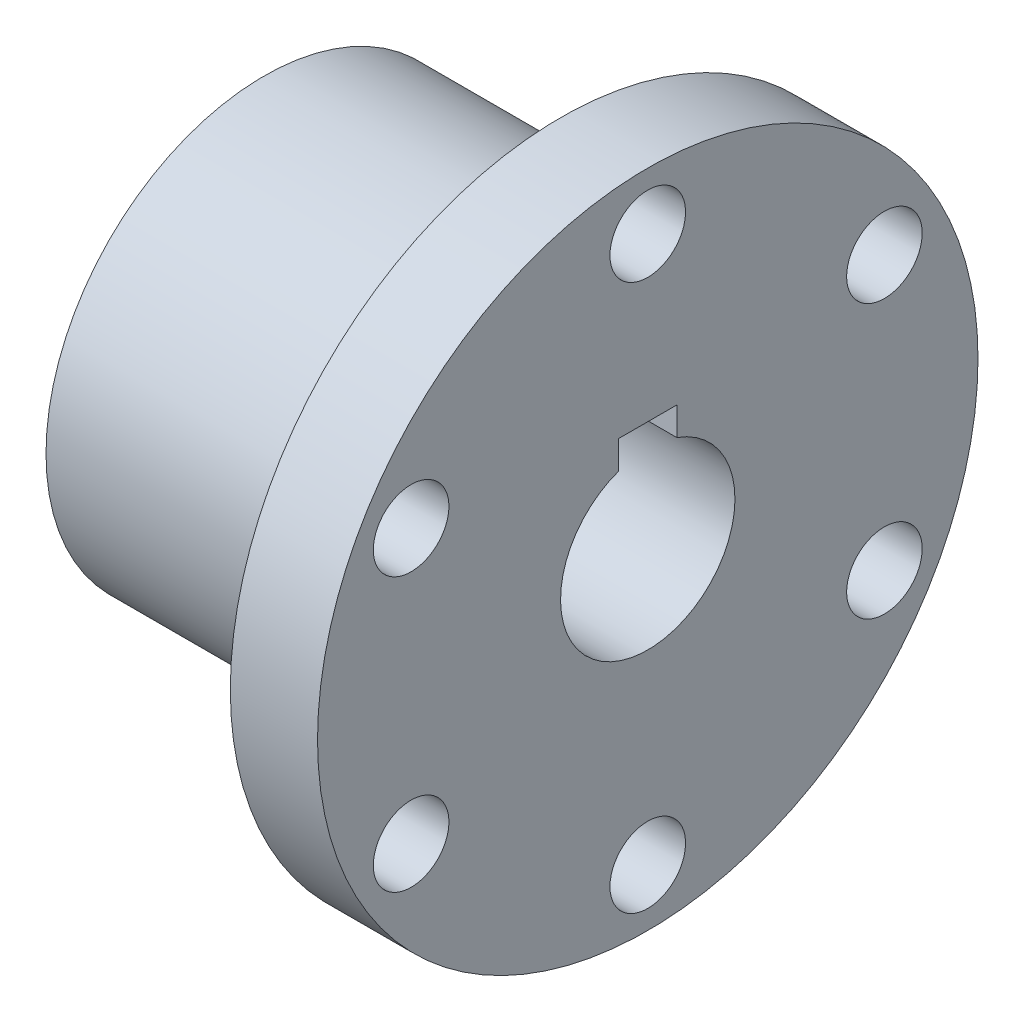
ISO-10303-21;
HEADER;
FILE_DESCRIPTION(('STEP AP214'),'2;1');
FILE_NAME('part.step','',(''),(''),'','','');
FILE_SCHEMA(('AUTOMOTIVE_DESIGN { 1 0 10303 214 1 1 1 1 }'));
ENDSEC;
DATA;
#1=APPLICATION_CONTEXT('core data for automotive mechanical design processes');
#2=APPLICATION_PROTOCOL_DEFINITION('international standard','automotive_design',2000,#1);
#3=PRODUCT_CONTEXT('',#1,'mechanical');
#4=PRODUCT('Part','Part','',(#3));
#5=PRODUCT_RELATED_PRODUCT_CATEGORY('part','',(#4));
#6=PRODUCT_DEFINITION_FORMATION('','',#4);
#7=PRODUCT_DEFINITION_CONTEXT('part definition',#1,'design');
#8=PRODUCT_DEFINITION('design','',#6,#7);
#9=PRODUCT_DEFINITION_SHAPE('','',#8);
#10=(LENGTH_UNIT() NAMED_UNIT(*) SI_UNIT(.MILLI.,.METRE.));
#11=(NAMED_UNIT(*) PLANE_ANGLE_UNIT() SI_UNIT($,.RADIAN.));
#12=(NAMED_UNIT(*) SI_UNIT($,.STERADIAN.) SOLID_ANGLE_UNIT());
#13=UNCERTAINTY_MEASURE_WITH_UNIT(LENGTH_MEASURE(1.E-05),#10,'distance_accuracy_value','');
#14=(GEOMETRIC_REPRESENTATION_CONTEXT(3) GLOBAL_UNCERTAINTY_ASSIGNED_CONTEXT((#13)) GLOBAL_UNIT_ASSIGNED_CONTEXT((#10,
#11,#12)) REPRESENTATION_CONTEXT('',''));
#15=CARTESIAN_POINT('',(0.,0.,0.));
#16=DIRECTION('',(0.,0.,1.));
#17=DIRECTION('',(1.,0.,0.));
#18=AXIS2_PLACEMENT_3D('',#15,#16,#17);
#19=CARTESIAN_POINT('',(0.,0.,0.));
#20=DIRECTION('',(-1.,0.,0.));
#21=DIRECTION('',(0.,0.,1.));
#22=AXIS2_PLACEMENT_3D('',#19,#20,#21);
#23=CYLINDRICAL_SURFACE('',#22,6.);
#24=CARTESIAN_POINT('',(26.4,0.,0.));
#25=DIRECTION('',(-1.,0.,0.));
#26=DIRECTION('',(0.,0.,1.));
#27=AXIS2_PLACEMENT_3D('',#24,#25,#26);
#28=CIRCLE('',#27,6.);
#29=CARTESIAN_POINT('',(26.4,5.65685424949238,-2.));
#30=VERTEX_POINT('',#29);
#31=CARTESIAN_POINT('',(26.4,5.65685424949238,2.));
#32=VERTEX_POINT('',#31);
#33=EDGE_CURVE('E154',#30,#32,#28,.T.);
#34=ORIENTED_EDGE('',*,*,#33,.F.);
#35=DIRECTION('',(-1.,0.,0.));
#36=VECTOR('',#35,1.);
#37=CARTESIAN_POINT('',(0.,5.65685424949238,-2.));
#38=LINE('',#37,#36);
#39=CARTESIAN_POINT('',(0.,5.65685424949238,-2.));
#40=VERTEX_POINT('',#39);
#41=EDGE_CURVE('E57',#30,#40,#38,.T.);
#42=ORIENTED_EDGE('',*,*,#41,.T.);
#43=CARTESIAN_POINT('',(0.,0.,0.));
#44=DIRECTION('',(-1.,0.,0.));
#45=DIRECTION('',(0.,0.,1.));
#46=AXIS2_PLACEMENT_3D('',#43,#44,#45);
#47=CIRCLE('',#46,6.);
#48=CARTESIAN_POINT('',(0.,5.65685424949238,2.));
#49=VERTEX_POINT('',#48);
#50=EDGE_CURVE('E169',#40,#49,#47,.T.);
#51=ORIENTED_EDGE('',*,*,#50,.T.);
#52=DIRECTION('',(-1.,0.,0.));
#53=VECTOR('',#52,1.);
#54=CARTESIAN_POINT('',(0.,5.65685424949238,2.));
#55=LINE('',#54,#53);
#56=EDGE_CURVE('E86',#49,#32,#55,.F.);
#57=ORIENTED_EDGE('',*,*,#56,.T.);
#58=EDGE_LOOP('',(#34,#42,#51,#57));
#59=FACE_BOUND('',#58,.T.);
#60=ADVANCED_FACE('F35',(#59),#23,.F.);
#61=CARTESIAN_POINT('',(0.,6.,0.));
#62=DIRECTION('',(1.,0.,0.));
#63=DIRECTION('',(0.,0.,-1.));
#64=AXIS2_PLACEMENT_3D('',#61,#62,#63);
#65=PLANE('',#64);
#66=ORIENTED_EDGE('',*,*,#50,.F.);
#67=DIRECTION('',(0.,-1.,0.));
#68=VECTOR('',#67,1.);
#69=CARTESIAN_POINT('',(0.,2.86392079514251,-2.));
#70=LINE('',#69,#68);
#71=CARTESIAN_POINT('',(0.,7.6,-2.));
#72=VERTEX_POINT('',#71);
#73=EDGE_CURVE('E90',#72,#40,#70,.T.);
#74=ORIENTED_EDGE('',*,*,#73,.F.);
#75=DIRECTION('',(0.,0.,-1.));
#76=VECTOR('',#75,1.);
#77=CARTESIAN_POINT('',(0.,7.6,-2.));
#78=LINE('',#77,#76);
#79=CARTESIAN_POINT('',(0.,7.6,2.));
#80=VERTEX_POINT('',#79);
#81=EDGE_CURVE('E76',#80,#72,#78,.T.);
#82=ORIENTED_EDGE('',*,*,#81,.F.);
#83=DIRECTION('',(0.,1.,0.));
#84=VECTOR('',#83,1.);
#85=CARTESIAN_POINT('',(0.,2.86392079514251,2.));
#86=LINE('',#85,#84);
#87=EDGE_CURVE('E83',#49,#80,#86,.T.);
#88=ORIENTED_EDGE('',*,*,#87,.F.);
#89=EDGE_LOOP('',(#66,#74,#82,#88));
#90=FACE_BOUND('',#89,.T.);
#91=CARTESIAN_POINT('',(0.,0.,0.));
#92=DIRECTION('',(-1.,0.,0.));
#93=DIRECTION('',(0.,0.,1.));
#94=AXIS2_PLACEMENT_3D('',#91,#92,#93);
#95=CIRCLE('',#94,15.);
#96=CARTESIAN_POINT('',(0.,0.,15.));
#97=VERTEX_POINT('',#96);
#98=EDGE_CURVE('E166',#97,#97,#95,.T.);
#99=ORIENTED_EDGE('',*,*,#98,.T.);
#100=EDGE_LOOP('',(#99));
#101=FACE_BOUND('',#100,.T.);
#102=ADVANCED_FACE('F92',(#90,#101),#65,.F.);
#103=CARTESIAN_POINT('',(0.,0.,0.));
#104=DIRECTION('',(-1.,0.,0.));
#105=DIRECTION('',(0.,0.,1.));
#106=AXIS2_PLACEMENT_3D('',#103,#104,#105);
#107=CYLINDRICAL_SURFACE('',#106,15.);
#108=ORIENTED_EDGE('',*,*,#98,.F.);
#109=EDGE_LOOP('',(#108));
#110=FACE_BOUND('',#109,.T.);
#111=CARTESIAN_POINT('',(20.4,0.,0.));
#112=DIRECTION('',(-1.,0.,0.));
#113=DIRECTION('',(0.,0.,1.));
#114=AXIS2_PLACEMENT_3D('',#111,#112,#113);
#115=CIRCLE('',#114,15.);
#116=CARTESIAN_POINT('',(20.4,0.,15.));
#117=VERTEX_POINT('',#116);
#118=EDGE_CURVE('E163',#117,#117,#115,.T.);
#119=ORIENTED_EDGE('',*,*,#118,.T.);
#120=EDGE_LOOP('',(#119));
#121=FACE_BOUND('',#120,.T.);
#122=ADVANCED_FACE('F180',(#110,#121),#107,.T.);
#123=CARTESIAN_POINT('',(20.4,15.,0.));
#124=DIRECTION('',(1.,0.,0.));
#125=DIRECTION('',(0.,0.,-1.));
#126=AXIS2_PLACEMENT_3D('',#123,#124,#125);
#127=PLANE('',#126);
#128=CARTESIAN_POINT('',(20.4,18.8,1.2887694822869E-12));
#129=DIRECTION('',(-1.,0.,0.));
#130=DIRECTION('',(0.,0.,1.));
#131=AXIS2_PLACEMENT_3D('',#128,#129,#130);
#132=CIRCLE('',#131,2.625);
#133=CARTESIAN_POINT('',(20.4,18.8,2.62500000000129));
#134=VERTEX_POINT('',#133);
#135=EDGE_CURVE('E100',#134,#134,#132,.T.);
#136=ORIENTED_EDGE('',*,*,#135,.F.);
#137=EDGE_LOOP('',(#136));
#138=FACE_BOUND('',#137,.T.);
#139=CARTESIAN_POINT('',(20.4,-9.40000000000031,16.2812775911482));
#140=DIRECTION('',(-1.,0.,0.));
#141=DIRECTION('',(0.,0.,1.));
#142=AXIS2_PLACEMENT_3D('',#139,#140,#141);
#143=CIRCLE('',#142,2.625);
#144=CARTESIAN_POINT('',(20.4,-9.40000000000031,18.9062775911482));
#145=VERTEX_POINT('',#144);
#146=EDGE_CURVE('E109',#145,#145,#143,.T.);
#147=ORIENTED_EDGE('',*,*,#146,.F.);
#148=EDGE_LOOP('',(#147));
#149=FACE_BOUND('',#148,.T.);
#150=CARTESIAN_POINT('',(20.4,-9.39999999999969,-16.2812775911467));
#151=DIRECTION('',(-1.,0.,0.));
#152=DIRECTION('',(0.,0.,1.));
#153=AXIS2_PLACEMENT_3D('',#150,#151,#152);
#154=CIRCLE('',#153,2.625);
#155=CARTESIAN_POINT('',(20.4,-9.39999999999969,-13.6562775911467));
#156=VERTEX_POINT('',#155);
#157=EDGE_CURVE('E118',#156,#156,#154,.T.);
#158=ORIENTED_EDGE('',*,*,#157,.F.);
#159=EDGE_LOOP('',(#158));
#160=FACE_BOUND('',#159,.T.);
#161=CARTESIAN_POINT('',(20.4,-18.8,0.));
#162=DIRECTION('',(-1.,0.,0.));
#163=DIRECTION('',(0.,0.,1.));
#164=AXIS2_PLACEMENT_3D('',#161,#162,#163);
#165=CIRCLE('',#164,2.625);
#166=CARTESIAN_POINT('',(20.4,-18.8,2.625));
#167=VERTEX_POINT('',#166);
#168=EDGE_CURVE('E127',#167,#167,#165,.T.);
#169=ORIENTED_EDGE('',*,*,#168,.F.);
#170=EDGE_LOOP('',(#169));
#171=FACE_BOUND('',#170,.T.);
#172=CARTESIAN_POINT('',(20.4,9.4,-16.2812775911474));
#173=DIRECTION('',(-1.,0.,0.));
#174=DIRECTION('',(0.,0.,1.));
#175=AXIS2_PLACEMENT_3D('',#172,#173,#174);
#176=CIRCLE('',#175,2.625);
#177=CARTESIAN_POINT('',(20.4,9.4,-13.6562775911474));
#178=VERTEX_POINT('',#177);
#179=EDGE_CURVE('E136',#178,#178,#176,.T.);
#180=ORIENTED_EDGE('',*,*,#179,.F.);
#181=EDGE_LOOP('',(#180));
#182=FACE_BOUND('',#181,.T.);
#183=CARTESIAN_POINT('',(20.4,9.4,16.2812775911475));
#184=DIRECTION('',(-1.,0.,0.));
#185=DIRECTION('',(0.,0.,1.));
#186=AXIS2_PLACEMENT_3D('',#183,#184,#185);
#187=CIRCLE('',#186,2.625);
#188=CARTESIAN_POINT('',(20.4,9.4,18.9062775911475));
#189=VERTEX_POINT('',#188);
#190=EDGE_CURVE('E145',#189,#189,#187,.T.);
#191=ORIENTED_EDGE('',*,*,#190,.F.);
#192=EDGE_LOOP('',(#191));
#193=FACE_BOUND('',#192,.T.);
#194=ORIENTED_EDGE('',*,*,#118,.F.);
#195=EDGE_LOOP('',(#194));
#196=FACE_BOUND('',#195,.T.);
#197=CARTESIAN_POINT('',(20.4,0.,0.));
#198=DIRECTION('',(-1.,0.,0.));
#199=DIRECTION('',(0.,0.,1.));
#200=AXIS2_PLACEMENT_3D('',#197,#198,#199);
#201=CIRCLE('',#200,22.72);
#202=CARTESIAN_POINT('',(20.4,0.,22.72));
#203=VERTEX_POINT('',#202);
#204=EDGE_CURVE('E160',#203,#203,#201,.T.);
#205=ORIENTED_EDGE('',*,*,#204,.T.);
#206=EDGE_LOOP('',(#205));
#207=FACE_BOUND('',#206,.T.);
#208=ADVANCED_FACE('F184',(#138,#149,#160,#171,#182,#193,#196,#207),#127,.F.);
#209=CARTESIAN_POINT('',(0.,0.,0.));
#210=DIRECTION('',(-1.,0.,0.));
#211=DIRECTION('',(0.,0.,1.));
#212=AXIS2_PLACEMENT_3D('',#209,#210,#211);
#213=CYLINDRICAL_SURFACE('',#212,22.72);
#214=ORIENTED_EDGE('',*,*,#204,.F.);
#215=EDGE_LOOP('',(#214));
#216=FACE_BOUND('',#215,.T.);
#217=CARTESIAN_POINT('',(26.4,0.,0.));
#218=DIRECTION('',(-1.,0.,0.));
#219=DIRECTION('',(0.,0.,1.));
#220=AXIS2_PLACEMENT_3D('',#217,#218,#219);
#221=CIRCLE('',#220,22.72);
#222=CARTESIAN_POINT('',(26.4,0.,22.72));
#223=VERTEX_POINT('',#222);
#224=EDGE_CURVE('E157',#223,#223,#221,.T.);
#225=ORIENTED_EDGE('',*,*,#224,.T.);
#226=EDGE_LOOP('',(#225));
#227=FACE_BOUND('',#226,.T.);
#228=ADVANCED_FACE('F190',(#216,#227),#213,.T.);
#229=CARTESIAN_POINT('',(26.4,22.72,0.));
#230=DIRECTION('',(-1.,0.,0.));
#231=DIRECTION('',(0.,0.,1.));
#232=AXIS2_PLACEMENT_3D('',#229,#230,#231);
#233=PLANE('',#232);
#234=CARTESIAN_POINT('',(26.4,18.8,1.2887694822869E-12));
#235=DIRECTION('',(-1.,0.,0.));
#236=DIRECTION('',(0.,0.,1.));
#237=AXIS2_PLACEMENT_3D('',#234,#235,#236);
#238=CIRCLE('',#237,2.6);
#239=CARTESIAN_POINT('',(26.4,18.8,2.60000000000129));
#240=VERTEX_POINT('',#239);
#241=EDGE_CURVE('E106',#240,#240,#238,.T.);
#242=ORIENTED_EDGE('',*,*,#241,.T.);
#243=EDGE_LOOP('',(#242));
#244=FACE_BOUND('',#243,.T.);
#245=CARTESIAN_POINT('',(26.4,-9.40000000000031,16.2812775911482));
#246=DIRECTION('',(-1.,0.,0.));
#247=DIRECTION('',(0.,0.,1.));
#248=AXIS2_PLACEMENT_3D('',#245,#246,#247);
#249=CIRCLE('',#248,2.6);
#250=CARTESIAN_POINT('',(26.4,-9.40000000000031,18.8812775911482));
#251=VERTEX_POINT('',#250);
#252=EDGE_CURVE('E115',#251,#251,#249,.T.);
#253=ORIENTED_EDGE('',*,*,#252,.T.);
#254=EDGE_LOOP('',(#253));
#255=FACE_BOUND('',#254,.T.);
#256=CARTESIAN_POINT('',(26.4,-9.39999999999969,-16.2812775911467));
#257=DIRECTION('',(-1.,0.,0.));
#258=DIRECTION('',(0.,0.,1.));
#259=AXIS2_PLACEMENT_3D('',#256,#257,#258);
#260=CIRCLE('',#259,2.6);
#261=CARTESIAN_POINT('',(26.4,-9.39999999999969,-13.6812775911467));
#262=VERTEX_POINT('',#261);
#263=EDGE_CURVE('E124',#262,#262,#260,.T.);
#264=ORIENTED_EDGE('',*,*,#263,.T.);
#265=EDGE_LOOP('',(#264));
#266=FACE_BOUND('',#265,.T.);
#267=CARTESIAN_POINT('',(26.4,-18.8,0.));
#268=DIRECTION('',(-1.,0.,0.));
#269=DIRECTION('',(0.,0.,1.));
#270=AXIS2_PLACEMENT_3D('',#267,#268,#269);
#271=CIRCLE('',#270,2.6);
#272=CARTESIAN_POINT('',(26.4,-18.8,2.6));
#273=VERTEX_POINT('',#272);
#274=EDGE_CURVE('E133',#273,#273,#271,.T.);
#275=ORIENTED_EDGE('',*,*,#274,.T.);
#276=EDGE_LOOP('',(#275));
#277=FACE_BOUND('',#276,.T.);
#278=CARTESIAN_POINT('',(26.4,9.4,-16.2812775911474));
#279=DIRECTION('',(-1.,0.,0.));
#280=DIRECTION('',(0.,0.,1.));
#281=AXIS2_PLACEMENT_3D('',#278,#279,#280);
#282=CIRCLE('',#281,2.6);
#283=CARTESIAN_POINT('',(26.4,9.4,-13.6812775911474));
#284=VERTEX_POINT('',#283);
#285=EDGE_CURVE('E142',#284,#284,#282,.T.);
#286=ORIENTED_EDGE('',*,*,#285,.T.);
#287=EDGE_LOOP('',(#286));
#288=FACE_BOUND('',#287,.T.);
#289=CARTESIAN_POINT('',(26.4,9.4,16.2812775911475));
#290=DIRECTION('',(-1.,0.,0.));
#291=DIRECTION('',(0.,0.,1.));
#292=AXIS2_PLACEMENT_3D('',#289,#290,#291);
#293=CIRCLE('',#292,2.6);
#294=CARTESIAN_POINT('',(26.4,9.4,18.8812775911475));
#295=VERTEX_POINT('',#294);
#296=EDGE_CURVE('E151',#295,#295,#293,.T.);
#297=ORIENTED_EDGE('',*,*,#296,.T.);
#298=EDGE_LOOP('',(#297));
#299=FACE_BOUND('',#298,.T.);
#300=ORIENTED_EDGE('',*,*,#224,.F.);
#301=EDGE_LOOP('',(#300));
#302=FACE_BOUND('',#301,.T.);
#303=DIRECTION('',(0.,0.,-1.));
#304=VECTOR('',#303,1.);
#305=CARTESIAN_POINT('',(26.4,7.6,0.));
#306=LINE('',#305,#304);
#307=CARTESIAN_POINT('',(26.4,7.6,2.));
#308=VERTEX_POINT('',#307);
#309=CARTESIAN_POINT('',(26.4,7.6,-2.));
#310=VERTEX_POINT('',#309);
#311=EDGE_CURVE('E42',#308,#310,#306,.T.);
#312=ORIENTED_EDGE('',*,*,#311,.T.);
#313=DIRECTION('',(0.,-1.,0.));
#314=VECTOR('',#313,1.);
#315=CARTESIAN_POINT('',(26.4,22.72,-2.));
#316=LINE('',#315,#314);
#317=EDGE_CURVE('E11',#310,#30,#316,.T.);
#318=ORIENTED_EDGE('',*,*,#317,.T.);
#319=ORIENTED_EDGE('',*,*,#33,.T.);
#320=DIRECTION('',(0.,1.,0.));
#321=VECTOR('',#320,1.);
#322=CARTESIAN_POINT('',(26.4,22.72,2.));
#323=LINE('',#322,#321);
#324=EDGE_CURVE('E171',#32,#308,#323,.T.);
#325=ORIENTED_EDGE('',*,*,#324,.T.);
#326=EDGE_LOOP('',(#312,#318,#319,#325));
#327=FACE_BOUND('',#326,.T.);
#328=ADVANCED_FACE('F173',(#244,#255,#266,#277,#288,#299,#302,#327),#233,.F.);
#329=CARTESIAN_POINT('',(20.4,9.4,16.2812775911475));
#330=DIRECTION('',(-1.,0.,0.));
#331=DIRECTION('',(0.,0.,1.));
#332=AXIS2_PLACEMENT_3D('',#329,#330,#331);
#333=CYLINDRICAL_SURFACE('',#332,2.6);
#334=ORIENTED_EDGE('',*,*,#296,.F.);
#335=EDGE_LOOP('',(#334));
#336=FACE_BOUND('',#335,.T.);
#337=CARTESIAN_POINT('',(20.425,9.4,16.2812775911475));
#338=DIRECTION('',(-1.,0.,0.));
#339=DIRECTION('',(0.,0.,1.));
#340=AXIS2_PLACEMENT_3D('',#337,#338,#339);
#341=CIRCLE('',#340,2.6);
#342=CARTESIAN_POINT('',(20.425,9.4,18.8812775911475));
#343=VERTEX_POINT('',#342);
#344=EDGE_CURVE('E148',#343,#343,#341,.T.);
#345=ORIENTED_EDGE('',*,*,#344,.T.);
#346=EDGE_LOOP('',(#345));
#347=FACE_BOUND('',#346,.T.);
#348=ADVANCED_FACE('F197',(#336,#347),#333,.F.);
#349=CARTESIAN_POINT('',(20.4,9.4,16.2812775911475));
#350=DIRECTION('',(-1.,0.,0.));
#351=DIRECTION('',(0.,0.,1.));
#352=AXIS2_PLACEMENT_3D('',#349,#350,#351);
#353=CONICAL_SURFACE('',#352,2.625,0.785398163397448);
#354=ORIENTED_EDGE('',*,*,#344,.F.);
#355=EDGE_LOOP('',(#354));
#356=FACE_BOUND('',#355,.T.);
#357=ORIENTED_EDGE('',*,*,#190,.T.);
#358=EDGE_LOOP('',(#357));
#359=FACE_BOUND('',#358,.T.);
#360=ADVANCED_FACE('F201',(#356,#359),#353,.F.);
#361=CARTESIAN_POINT('',(20.4,9.4,-16.2812775911474));
#362=DIRECTION('',(-1.,0.,0.));
#363=DIRECTION('',(0.,0.,1.));
#364=AXIS2_PLACEMENT_3D('',#361,#362,#363);
#365=CYLINDRICAL_SURFACE('',#364,2.6);
#366=ORIENTED_EDGE('',*,*,#285,.F.);
#367=EDGE_LOOP('',(#366));
#368=FACE_BOUND('',#367,.T.);
#369=CARTESIAN_POINT('',(20.425,9.4,-16.2812775911474));
#370=DIRECTION('',(-1.,0.,0.));
#371=DIRECTION('',(0.,0.,1.));
#372=AXIS2_PLACEMENT_3D('',#369,#370,#371);
#373=CIRCLE('',#372,2.6);
#374=CARTESIAN_POINT('',(20.425,9.4,-13.6812775911474));
#375=VERTEX_POINT('',#374);
#376=EDGE_CURVE('E139',#375,#375,#373,.T.);
#377=ORIENTED_EDGE('',*,*,#376,.T.);
#378=EDGE_LOOP('',(#377));
#379=FACE_BOUND('',#378,.T.);
#380=ADVANCED_FACE('F205',(#368,#379),#365,.F.);
#381=CARTESIAN_POINT('',(20.4,9.4,-16.2812775911474));
#382=DIRECTION('',(-1.,0.,0.));
#383=DIRECTION('',(0.,0.,1.));
#384=AXIS2_PLACEMENT_3D('',#381,#382,#383);
#385=CONICAL_SURFACE('',#384,2.625,0.785398163397448);
#386=ORIENTED_EDGE('',*,*,#376,.F.);
#387=EDGE_LOOP('',(#386));
#388=FACE_BOUND('',#387,.T.);
#389=ORIENTED_EDGE('',*,*,#179,.T.);
#390=EDGE_LOOP('',(#389));
#391=FACE_BOUND('',#390,.T.);
#392=ADVANCED_FACE('F209',(#388,#391),#385,.F.);
#393=CARTESIAN_POINT('',(20.4,-18.8,0.));
#394=DIRECTION('',(-1.,0.,0.));
#395=DIRECTION('',(0.,0.,1.));
#396=AXIS2_PLACEMENT_3D('',#393,#394,#395);
#397=CYLINDRICAL_SURFACE('',#396,2.6);
#398=ORIENTED_EDGE('',*,*,#274,.F.);
#399=EDGE_LOOP('',(#398));
#400=FACE_BOUND('',#399,.T.);
#401=CARTESIAN_POINT('',(20.425,-18.8,0.));
#402=DIRECTION('',(-1.,0.,0.));
#403=DIRECTION('',(0.,0.,1.));
#404=AXIS2_PLACEMENT_3D('',#401,#402,#403);
#405=CIRCLE('',#404,2.6);
#406=CARTESIAN_POINT('',(20.425,-18.8,2.6));
#407=VERTEX_POINT('',#406);
#408=EDGE_CURVE('E130',#407,#407,#405,.T.);
#409=ORIENTED_EDGE('',*,*,#408,.T.);
#410=EDGE_LOOP('',(#409));
#411=FACE_BOUND('',#410,.T.);
#412=ADVANCED_FACE('F213',(#400,#411),#397,.F.);
#413=CARTESIAN_POINT('',(20.4,-18.8,0.));
#414=DIRECTION('',(-1.,0.,0.));
#415=DIRECTION('',(0.,0.,1.));
#416=AXIS2_PLACEMENT_3D('',#413,#414,#415);
#417=CONICAL_SURFACE('',#416,2.625,0.785398163397379);
#418=ORIENTED_EDGE('',*,*,#408,.F.);
#419=EDGE_LOOP('',(#418));
#420=FACE_BOUND('',#419,.T.);
#421=ORIENTED_EDGE('',*,*,#168,.T.);
#422=EDGE_LOOP('',(#421));
#423=FACE_BOUND('',#422,.T.);
#424=ADVANCED_FACE('F217',(#420,#423),#417,.F.);
#425=CARTESIAN_POINT('',(20.4,-9.39999999999969,-16.2812775911467));
#426=DIRECTION('',(-1.,0.,0.));
#427=DIRECTION('',(0.,0.,1.));
#428=AXIS2_PLACEMENT_3D('',#425,#426,#427);
#429=CYLINDRICAL_SURFACE('',#428,2.6);
#430=ORIENTED_EDGE('',*,*,#263,.F.);
#431=EDGE_LOOP('',(#430));
#432=FACE_BOUND('',#431,.T.);
#433=CARTESIAN_POINT('',(20.425,-9.39999999999969,-16.2812775911467));
#434=DIRECTION('',(-1.,0.,0.));
#435=DIRECTION('',(0.,0.,1.));
#436=AXIS2_PLACEMENT_3D('',#433,#434,#435);
#437=CIRCLE('',#436,2.6);
#438=CARTESIAN_POINT('',(20.425,-9.39999999999969,-13.6812775911467));
#439=VERTEX_POINT('',#438);
#440=EDGE_CURVE('E121',#439,#439,#437,.T.);
#441=ORIENTED_EDGE('',*,*,#440,.T.);
#442=EDGE_LOOP('',(#441));
#443=FACE_BOUND('',#442,.T.);
#444=ADVANCED_FACE('F221',(#432,#443),#429,.F.);
#445=CARTESIAN_POINT('',(20.4,-9.39999999999969,-16.2812775911467));
#446=DIRECTION('',(-1.,0.,0.));
#447=DIRECTION('',(0.,0.,1.));
#448=AXIS2_PLACEMENT_3D('',#445,#446,#447);
#449=CONICAL_SURFACE('',#448,2.625,0.785398163397448);
#450=ORIENTED_EDGE('',*,*,#440,.F.);
#451=EDGE_LOOP('',(#450));
#452=FACE_BOUND('',#451,.T.);
#453=ORIENTED_EDGE('',*,*,#157,.T.);
#454=EDGE_LOOP('',(#453));
#455=FACE_BOUND('',#454,.T.);
#456=ADVANCED_FACE('F225',(#452,#455),#449,.F.);
#457=CARTESIAN_POINT('',(20.4,-9.40000000000031,16.2812775911482));
#458=DIRECTION('',(-1.,0.,0.));
#459=DIRECTION('',(0.,0.,1.));
#460=AXIS2_PLACEMENT_3D('',#457,#458,#459);
#461=CYLINDRICAL_SURFACE('',#460,2.6);
#462=ORIENTED_EDGE('',*,*,#252,.F.);
#463=EDGE_LOOP('',(#462));
#464=FACE_BOUND('',#463,.T.);
#465=CARTESIAN_POINT('',(20.425,-9.40000000000031,16.2812775911482));
#466=DIRECTION('',(-1.,0.,0.));
#467=DIRECTION('',(0.,0.,1.));
#468=AXIS2_PLACEMENT_3D('',#465,#466,#467);
#469=CIRCLE('',#468,2.6);
#470=CARTESIAN_POINT('',(20.425,-9.40000000000031,18.8812775911482));
#471=VERTEX_POINT('',#470);
#472=EDGE_CURVE('E112',#471,#471,#469,.T.);
#473=ORIENTED_EDGE('',*,*,#472,.T.);
#474=EDGE_LOOP('',(#473));
#475=FACE_BOUND('',#474,.T.);
#476=ADVANCED_FACE('F229',(#464,#475),#461,.F.);
#477=CARTESIAN_POINT('',(20.4,-9.40000000000031,16.2812775911482));
#478=DIRECTION('',(-1.,0.,0.));
#479=DIRECTION('',(0.,0.,1.));
#480=AXIS2_PLACEMENT_3D('',#477,#478,#479);
#481=CONICAL_SURFACE('',#480,2.625,0.785398163397448);
#482=ORIENTED_EDGE('',*,*,#472,.F.);
#483=EDGE_LOOP('',(#482));
#484=FACE_BOUND('',#483,.T.);
#485=ORIENTED_EDGE('',*,*,#146,.T.);
#486=EDGE_LOOP('',(#485));
#487=FACE_BOUND('',#486,.T.);
#488=ADVANCED_FACE('F233',(#484,#487),#481,.F.);
#489=CARTESIAN_POINT('',(20.4,18.8,1.2887694822869E-12));
#490=DIRECTION('',(-1.,0.,0.));
#491=DIRECTION('',(0.,0.,1.));
#492=AXIS2_PLACEMENT_3D('',#489,#490,#491);
#493=CYLINDRICAL_SURFACE('',#492,2.6);
#494=ORIENTED_EDGE('',*,*,#241,.F.);
#495=EDGE_LOOP('',(#494));
#496=FACE_BOUND('',#495,.T.);
#497=CARTESIAN_POINT('',(20.425,18.8,1.2887694822869E-12));
#498=DIRECTION('',(-1.,0.,0.));
#499=DIRECTION('',(0.,0.,1.));
#500=AXIS2_PLACEMENT_3D('',#497,#498,#499);
#501=CIRCLE('',#500,2.6);
#502=CARTESIAN_POINT('',(20.425,18.8,2.60000000000129));
#503=VERTEX_POINT('',#502);
#504=EDGE_CURVE('E103',#503,#503,#501,.T.);
#505=ORIENTED_EDGE('',*,*,#504,.T.);
#506=EDGE_LOOP('',(#505));
#507=FACE_BOUND('',#506,.T.);
#508=ADVANCED_FACE('F237',(#496,#507),#493,.F.);
#509=CARTESIAN_POINT('',(20.4,18.8,1.2887694822869E-12));
#510=DIRECTION('',(-1.,0.,0.));
#511=DIRECTION('',(0.,0.,1.));
#512=AXIS2_PLACEMENT_3D('',#509,#510,#511);
#513=CONICAL_SURFACE('',#512,2.625,0.785398163397379);
#514=ORIENTED_EDGE('',*,*,#504,.F.);
#515=EDGE_LOOP('',(#514));
#516=FACE_BOUND('',#515,.T.);
#517=ORIENTED_EDGE('',*,*,#135,.T.);
#518=EDGE_LOOP('',(#517));
#519=FACE_BOUND('',#518,.T.);
#520=ADVANCED_FACE('F241',(#516,#519),#513,.F.);
#521=CARTESIAN_POINT('',(35.,2.86392079514251,-2.));
#522=DIRECTION('',(0.,0.,-1.));
#523=DIRECTION('',(-1.,0.,0.));
#524=AXIS2_PLACEMENT_3D('',#521,#522,#523);
#525=PLANE('',#524);
#526=ORIENTED_EDGE('',*,*,#317,.F.);
#527=DIRECTION('',(-1.,0.,0.));
#528=VECTOR('',#527,1.);
#529=CARTESIAN_POINT('',(35.,7.6,-2.));
#530=LINE('',#529,#528);
#531=EDGE_CURVE('E80',#310,#72,#530,.T.);
#532=ORIENTED_EDGE('',*,*,#531,.T.);
#533=ORIENTED_EDGE('',*,*,#73,.T.);
#534=ORIENTED_EDGE('',*,*,#41,.F.);
#535=EDGE_LOOP('',(#526,#532,#533,#534));
#536=FACE_BOUND('',#535,.T.);
#537=ADVANCED_FACE('F245',(#536),#525,.F.);
#538=CARTESIAN_POINT('',(35.,7.6,-2.));
#539=DIRECTION('',(0.,1.,0.));
#540=DIRECTION('',(0.,0.,1.));
#541=AXIS2_PLACEMENT_3D('',#538,#539,#540);
#542=PLANE('',#541);
#543=DIRECTION('',(-1.,0.,0.));
#544=VECTOR('',#543,1.);
#545=CARTESIAN_POINT('',(35.,7.6,2.));
#546=LINE('',#545,#544);
#547=EDGE_CURVE('E49',#308,#80,#546,.T.);
#548=ORIENTED_EDGE('',*,*,#547,.T.);
#549=ORIENTED_EDGE('',*,*,#81,.T.);
#550=ORIENTED_EDGE('',*,*,#531,.F.);
#551=ORIENTED_EDGE('',*,*,#311,.F.);
#552=EDGE_LOOP('',(#548,#549,#550,#551));
#553=FACE_BOUND('',#552,.T.);
#554=ADVANCED_FACE('F73',(#553),#542,.F.);
#555=CARTESIAN_POINT('',(35.,2.86392079514251,2.));
#556=DIRECTION('',(0.,0.,1.));
#557=DIRECTION('',(1.,0.,0.));
#558=AXIS2_PLACEMENT_3D('',#555,#556,#557);
#559=PLANE('',#558);
#560=ORIENTED_EDGE('',*,*,#87,.T.);
#561=ORIENTED_EDGE('',*,*,#547,.F.);
#562=ORIENTED_EDGE('',*,*,#324,.F.);
#563=ORIENTED_EDGE('',*,*,#56,.F.);
#564=EDGE_LOOP('',(#560,#561,#562,#563));
#565=FACE_BOUND('',#564,.T.);
#566=ADVANCED_FACE('F84',(#565),#559,.F.);
#567=CLOSED_SHELL('',(#60,#102,#122,#208,#228,#328,#348,#360,#380,#392,#412,#424,#444,#456,#476,
#488,#508,#520,#537,#554,#566));
#568=MANIFOLD_SOLID_BREP('B2',#567);
#569=ADVANCED_BREP_SHAPE_REPRESENTATION('',(#18,#568),#14);
#570=SHAPE_DEFINITION_REPRESENTATION(#9,#569);
ENDSEC;
END-ISO-10303-21;
